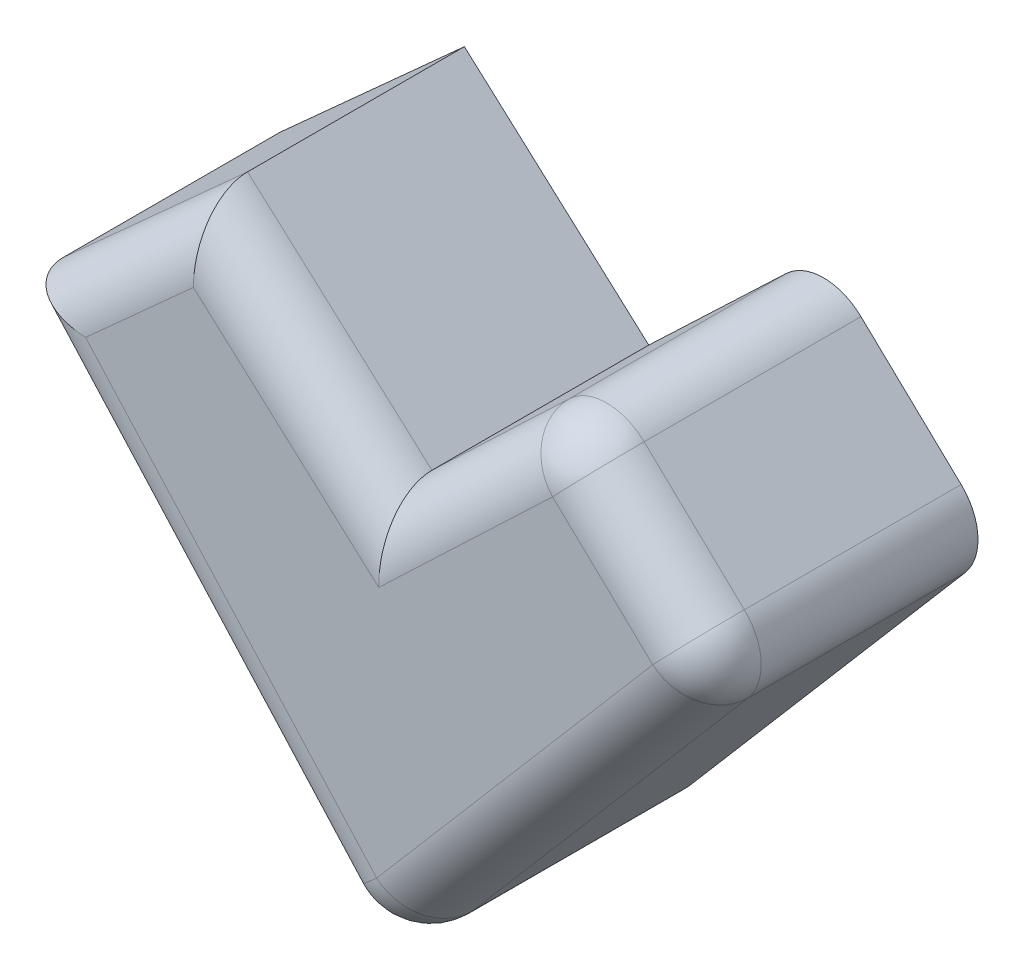
ISO-10303-21;
HEADER;
FILE_DESCRIPTION(('STEP AP214'),'2;1');
FILE_NAME('part.step','',(''),(''),'','','');
FILE_SCHEMA(('AUTOMOTIVE_DESIGN { 1 0 10303 214 1 1 1 1 }'));
ENDSEC;
DATA;
#1=APPLICATION_CONTEXT('core data for automotive mechanical design processes');
#2=APPLICATION_PROTOCOL_DEFINITION('international standard','automotive_design',2000,#1);
#3=PRODUCT_CONTEXT('',#1,'mechanical');
#4=PRODUCT('Part','Part','',(#3));
#5=PRODUCT_RELATED_PRODUCT_CATEGORY('part','',(#4));
#6=PRODUCT_DEFINITION_FORMATION('','',#4);
#7=PRODUCT_DEFINITION_CONTEXT('part definition',#1,'design');
#8=PRODUCT_DEFINITION('design','',#6,#7);
#9=PRODUCT_DEFINITION_SHAPE('','',#8);
#10=(LENGTH_UNIT() NAMED_UNIT(*) SI_UNIT(.MILLI.,.METRE.));
#11=(NAMED_UNIT(*) PLANE_ANGLE_UNIT() SI_UNIT($,.RADIAN.));
#12=(NAMED_UNIT(*) SI_UNIT($,.STERADIAN.) SOLID_ANGLE_UNIT());
#13=UNCERTAINTY_MEASURE_WITH_UNIT(LENGTH_MEASURE(1.E-05),#10,'distance_accuracy_value','');
#14=(GEOMETRIC_REPRESENTATION_CONTEXT(3) GLOBAL_UNCERTAINTY_ASSIGNED_CONTEXT((#13)) GLOBAL_UNIT_ASSIGNED_CONTEXT((#10,
#11,#12)) REPRESENTATION_CONTEXT('',''));
#15=CARTESIAN_POINT('',(0.,0.,0.));
#16=DIRECTION('',(0.,0.,1.));
#17=DIRECTION('',(1.,0.,0.));
#18=AXIS2_PLACEMENT_3D('',#15,#16,#17);
#19=CARTESIAN_POINT('',(64.5053511087993,75.4139,50.));
#20=DIRECTION('',(-0.759929047076846,0.650006033363442,0.));
#21=DIRECTION('',(-0.650006033363442,-0.759929047076846,0.));
#22=AXIS2_PLACEMENT_3D('',#19,#20,#21);
#23=PLANE('',#22);
#24=DIRECTION('',(0.650006033363442,0.759929047076846,0.));
#25=VECTOR('',#24,1.);
#26=CARTESIAN_POINT('',(0.,0.,40.));
#27=LINE('',#26,#25);
#28=CARTESIAN_POINT('',(58.3394809383722,68.2053148446183,40.));
#29=VERTEX_POINT('',#28);
#30=CARTESIAN_POINT('',(7.39998467828279,8.65140170446145,40.));
#31=VERTEX_POINT('',#30);
#32=EDGE_CURVE('E63',#29,#31,#27,.F.);
#33=ORIENTED_EDGE('',*,*,#32,.T.);
#34=DIRECTION('',(0.,0.,-1.));
#35=VECTOR('',#34,1.);
#36=CARTESIAN_POINT('',(7.39998467828279,8.65140170446145,50.));
#37=LINE('',#36,#35);
#38=CARTESIAN_POINT('',(7.39998467828281,8.65140170446147,0.));
#39=VERTEX_POINT('',#38);
#40=EDGE_CURVE('E229',#31,#39,#37,.T.);
#41=ORIENTED_EDGE('',*,*,#40,.T.);
#42=DIRECTION('',(0.650006033363442,0.759929047076846,0.));
#43=VECTOR('',#42,1.);
#44=CARTESIAN_POINT('',(64.5053511087993,75.4139,0.));
#45=LINE('',#44,#43);
#46=CARTESIAN_POINT('',(58.3394809383722,68.2053148446183,0.));
#47=VERTEX_POINT('',#46);
#48=EDGE_CURVE('E284',#39,#47,#45,.T.);
#49=ORIENTED_EDGE('',*,*,#48,.T.);
#50=DIRECTION('',(0.,0.,-1.));
#51=VECTOR('',#50,1.);
#52=CARTESIAN_POINT('',(58.3394809383722,68.2053148446183,50.));
#53=LINE('',#52,#51);
#54=EDGE_CURVE('E68',#47,#29,#53,.F.);
#55=ORIENTED_EDGE('',*,*,#54,.T.);
#56=EDGE_LOOP('',(#33,#41,#49,#55));
#57=FACE_BOUND('',#56,.T.);
#58=ADVANCED_FACE('F45',(#57),#23,.F.);
#59=CARTESIAN_POINT('',(32.2526755543997,106.09,50.));
#60=DIRECTION('',(-0.689175146522495,-0.724594795327498,0.));
#61=DIRECTION('',(0.724594795327498,-0.689175146522495,0.));
#62=AXIS2_PLACEMENT_3D('',#59,#60,#61);
#63=PLANE('',#62);
#64=DIRECTION('',(-0.724594795327498,0.689175146522495,0.));
#65=VECTOR('',#64,1.);
#66=CARTESIAN_POINT('',(64.5053511087993,75.4139,40.));
#67=LINE('',#66,#65);
#68=CARTESIAN_POINT('',(39.1444270196246,99.5351311871536,40.));
#69=VERTEX_POINT('',#68);
#70=CARTESIAN_POINT('',(57.6319419328287,81.9513231315277,40.));
#71=VERTEX_POINT('',#70);
#72=EDGE_CURVE('E219',#69,#71,#67,.F.);
#73=ORIENTED_EDGE('',*,*,#72,.T.);
#74=DIRECTION('',(0.,0.,-1.));
#75=VECTOR('',#74,1.);
#76=CARTESIAN_POINT('',(57.6319419328287,81.9513231315277,50.));
#77=LINE('',#76,#75);
#78=CARTESIAN_POINT('',(57.6319419328287,81.9513231315277,0.));
#79=VERTEX_POINT('',#78);
#80=EDGE_CURVE('E222',#71,#79,#77,.T.);
#81=ORIENTED_EDGE('',*,*,#80,.T.);
#82=DIRECTION('',(-0.724594795327498,0.689175146522495,0.));
#83=VECTOR('',#82,1.);
#84=CARTESIAN_POINT('',(32.2526755543997,106.09,0.));
#85=LINE('',#84,#83);
#86=CARTESIAN_POINT('',(39.1444270196246,99.5351311871536,0.));
#87=VERTEX_POINT('',#86);
#88=EDGE_CURVE('E148',#79,#87,#85,.T.);
#89=ORIENTED_EDGE('',*,*,#88,.T.);
#90=DIRECTION('',(0.,0.,-1.));
#91=VECTOR('',#90,1.);
#92=CARTESIAN_POINT('',(39.1444270196246,99.5351311871536,50.));
#93=LINE('',#92,#91);
#94=EDGE_CURVE('E216',#87,#69,#93,.F.);
#95=ORIENTED_EDGE('',*,*,#94,.T.);
#96=EDGE_LOOP('',(#73,#81,#89,#95));
#97=FACE_BOUND('',#96,.T.);
#98=ADVANCED_FACE('F294',(#97),#63,.F.);
#99=CARTESIAN_POINT('',(0.,75.4139,50.));
#100=DIRECTION('',(0.689175146522495,-0.724594795327498,0.));
#101=DIRECTION('',(0.724594795327498,0.689175146522495,0.));
#102=AXIS2_PLACEMENT_3D('',#99,#100,#101);
#103=PLANE('',#102);
#104=DIRECTION('',(0.,0.,-1.));
#105=VECTOR('',#104,1.);
#106=CARTESIAN_POINT('',(0.,75.4139,50.));
#107=LINE('',#106,#105);
#108=CARTESIAN_POINT('',(0.,75.4139,40.));
#109=VERTEX_POINT('',#108);
#110=CARTESIAN_POINT('',(0.,75.4139,0.));
#111=VERTEX_POINT('',#110);
#112=EDGE_CURVE('E139',#109,#111,#107,.T.);
#113=ORIENTED_EDGE('',*,*,#112,.F.);
#114=DIRECTION('',(-0.724594795327498,-0.689175146522495,0.));
#115=VECTOR('',#114,1.);
#116=CARTESIAN_POINT('',(32.2526755543997,106.09,40.));
#117=LINE('',#116,#115);
#118=CARTESIAN_POINT('',(25.3609240891747,99.5351311871536,40.));
#119=VERTEX_POINT('',#118);
#120=EDGE_CURVE('E213',#109,#119,#117,.F.);
#121=ORIENTED_EDGE('',*,*,#120,.T.);
#122=DIRECTION('',(0.,0.,-1.));
#123=VECTOR('',#122,1.);
#124=CARTESIAN_POINT('',(25.3609240891747,99.5351311871536,50.));
#125=LINE('',#124,#123);
#126=CARTESIAN_POINT('',(25.3609240891747,99.5351311871536,0.));
#127=VERTEX_POINT('',#126);
#128=EDGE_CURVE('E142',#119,#127,#125,.T.);
#129=ORIENTED_EDGE('',*,*,#128,.T.);
#130=DIRECTION('',(-0.724594795327498,-0.689175146522495,0.));
#131=VECTOR('',#130,1.);
#132=CARTESIAN_POINT('',(0.,75.4139,0.));
#133=LINE('',#132,#131);
#134=EDGE_CURVE('E136',#127,#111,#133,.T.);
#135=ORIENTED_EDGE('',*,*,#134,.T.);
#136=EDGE_LOOP('',(#113,#121,#129,#135));
#137=FACE_BOUND('',#136,.T.);
#138=ADVANCED_FACE('F138',(#137),#103,.F.);
#139=CARTESIAN_POINT('',(-34.0103244456003,106.09,50.));
#140=DIRECTION('',(-0.66977022809089,-0.742568408675643,0.));
#141=DIRECTION('',(0.742568408675643,-0.66977022809089,0.));
#142=AXIS2_PLACEMENT_3D('',#139,#140,#141);
#143=PLANE('',#142);
#144=DIRECTION('',(0.,0.,-1.));
#145=VECTOR('',#144,1.);
#146=CARTESIAN_POINT('',(-34.0103244456003,106.09,50.));
#147=LINE('',#146,#145);
#148=CARTESIAN_POINT('',(-34.0103244456003,106.09,40.));
#149=VERTEX_POINT('',#148);
#150=CARTESIAN_POINT('',(-34.0103244456003,106.09,0.));
#151=VERTEX_POINT('',#150);
#152=EDGE_CURVE('E159',#149,#151,#147,.T.);
#153=ORIENTED_EDGE('',*,*,#152,.F.);
#154=DIRECTION('',(-0.742568408675643,0.66977022809089,0.));
#155=VECTOR('',#154,1.);
#156=CARTESIAN_POINT('',(0.,75.4139,40.));
#157=LINE('',#156,#155);
#158=EDGE_CURVE('E156',#149,#109,#157,.F.);
#159=ORIENTED_EDGE('',*,*,#158,.T.);
#160=ORIENTED_EDGE('',*,*,#112,.T.);
#161=DIRECTION('',(-0.742568408675643,0.66977022809089,0.));
#162=VECTOR('',#161,1.);
#163=CARTESIAN_POINT('',(-34.0103244456003,106.09,0.));
#164=LINE('',#163,#162);
#165=EDGE_CURVE('E147',#111,#151,#164,.T.);
#166=ORIENTED_EDGE('',*,*,#165,.T.);
#167=EDGE_LOOP('',(#153,#159,#160,#166));
#168=FACE_BOUND('',#167,.T.);
#169=ADVANCED_FACE('F153',(#168),#143,.F.);
#170=CARTESIAN_POINT('',(-68.0206488912007,75.4139,50.));
#171=DIRECTION('',(0.66977022809089,-0.742568408675643,0.));
#172=DIRECTION('',(0.742568408675643,0.66977022809089,0.));
#173=AXIS2_PLACEMENT_3D('',#170,#171,#172);
#174=PLANE('',#173);
#175=DIRECTION('',(0.,0.,-1.));
#176=VECTOR('',#175,1.);
#177=CARTESIAN_POINT('',(-68.0206488912007,75.4139,50.));
#178=LINE('',#177,#176);
#179=CARTESIAN_POINT('',(-68.0206488912007,75.4139,40.));
#180=VERTEX_POINT('',#179);
#181=CARTESIAN_POINT('',(-68.0206488912007,75.4139,0.));
#182=VERTEX_POINT('',#181);
#183=EDGE_CURVE('E176',#180,#182,#178,.T.);
#184=ORIENTED_EDGE('',*,*,#183,.F.);
#185=DIRECTION('',(-0.742568408675643,-0.66977022809089,0.));
#186=VECTOR('',#185,1.);
#187=CARTESIAN_POINT('',(-34.0103244456003,106.09,40.));
#188=LINE('',#187,#186);
#189=EDGE_CURVE('E206',#180,#149,#188,.F.);
#190=ORIENTED_EDGE('',*,*,#189,.T.);
#191=ORIENTED_EDGE('',*,*,#152,.T.);
#192=DIRECTION('',(-0.742568408675643,-0.66977022809089,0.));
#193=VECTOR('',#192,1.);
#194=CARTESIAN_POINT('',(-68.0206488912007,75.4139,0.));
#195=LINE('',#194,#193);
#196=EDGE_CURVE('E165',#151,#182,#195,.T.);
#197=ORIENTED_EDGE('',*,*,#196,.T.);
#198=EDGE_LOOP('',(#184,#190,#191,#197));
#199=FACE_BOUND('',#198,.T.);
#200=ADVANCED_FACE('F316',(#199),#174,.F.);
#201=CARTESIAN_POINT('',(0.,0.,50.));
#202=DIRECTION('',(0.742568408675643,0.66977022809089,0.));
#203=DIRECTION('',(-0.66977022809089,0.742568408675643,0.));
#204=AXIS2_PLACEMENT_3D('',#201,#202,#203);
#205=PLANE('',#204);
#206=DIRECTION('',(0.,0.,-1.));
#207=VECTOR('',#206,1.);
#208=CARTESIAN_POINT('',(-7.62498987924212,8.45375975718697,50.));
#209=LINE('',#208,#207);
#210=CARTESIAN_POINT('',(-7.62498987924212,8.45375975718697,0.));
#211=VERTEX_POINT('',#210);
#212=CARTESIAN_POINT('',(-7.62498987924212,8.45375975718697,40.));
#213=VERTEX_POINT('',#212);
#214=EDGE_CURVE('E199',#211,#213,#209,.F.);
#215=ORIENTED_EDGE('',*,*,#214,.T.);
#216=DIRECTION('',(0.66977022809089,-0.742568408675643,0.));
#217=VECTOR('',#216,1.);
#218=CARTESIAN_POINT('',(-68.0206488912007,75.4139,40.));
#219=LINE('',#218,#217);
#220=EDGE_CURVE('E202',#213,#180,#219,.F.);
#221=ORIENTED_EDGE('',*,*,#220,.T.);
#222=ORIENTED_EDGE('',*,*,#183,.T.);
#223=DIRECTION('',(0.66977022809089,-0.742568408675643,0.));
#224=VECTOR('',#223,1.);
#225=CARTESIAN_POINT('',(0.,0.,0.));
#226=LINE('',#225,#224);
#227=EDGE_CURVE('E169',#182,#211,#226,.T.);
#228=ORIENTED_EDGE('',*,*,#227,.T.);
#229=EDGE_LOOP('',(#215,#221,#222,#228));
#230=FACE_BOUND('',#229,.T.);
#231=ADVANCED_FACE('F313',(#230),#205,.F.);
#232=CARTESIAN_POINT('',(0.,0.,50.));
#233=DIRECTION('',(0.,0.,1.));
#234=DIRECTION('',(1.,0.,0.));
#235=AXIS2_PLACEMENT_3D('',#232,#233,#234);
#236=PLANE('',#235);
#237=DIRECTION('',(-0.742568408675643,-0.66977022809089,0.));
#238=VECTOR('',#237,1.);
#239=CARTESIAN_POINT('',(-61.3229466102918,67.9882159132436,50.));
#240=LINE('',#239,#238);
#241=CARTESIAN_POINT('',(-34.0103244456003,92.623227264765,50.));
#242=VERTEX_POINT('',#241);
#243=CARTESIAN_POINT('',(-53.8972625235354,74.6859181941525,50.));
#244=VERTEX_POINT('',#243);
#245=EDGE_CURVE('E192',#242,#244,#240,.T.);
#246=ORIENTED_EDGE('',*,*,#245,.T.);
#247=DIRECTION('',(0.66977022809089,-0.742568408675643,0.));
#248=VECTOR('',#247,1.);
#249=CARTESIAN_POINT('',(7.42568408675643,6.6977022809089,50.));
#250=LINE('',#249,#248);
#251=CARTESIAN_POINT('',(-0.199305792485674,15.1514620380959,50.));
#252=VERTEX_POINT('',#251);
#253=EDGE_CURVE('E195',#244,#252,#250,.T.);
#254=ORIENTED_EDGE('',*,*,#253,.T.);
#255=DIRECTION('',(0.650006033363442,0.759929047076846,0.));
#256=VECTOR('',#255,1.);
#257=CARTESIAN_POINT('',(56.9060606380309,81.9139603336344,50.));
#258=LINE('',#257,#256);
#259=CARTESIAN_POINT('',(50.7401904676038,74.7053751782528,50.));
#260=VERTEX_POINT('',#259);
#261=EDGE_CURVE('E158',#252,#260,#258,.T.);
#262=ORIENTED_EDGE('',*,*,#261,.T.);
#263=DIRECTION('',(-0.724594795327498,0.689175146522495,0.));
#264=VECTOR('',#263,1.);
#265=CARTESIAN_POINT('',(25.3609240891747,98.844052046725,50.));
#266=LINE('',#265,#264);
#267=CARTESIAN_POINT('',(32.2526755543997,92.2891832338786,50.));
#268=VERTEX_POINT('',#267);
#269=EDGE_CURVE('E183',#260,#268,#266,.T.);
#270=ORIENTED_EDGE('',*,*,#269,.T.);
#271=DIRECTION('',(-0.724594795327498,-0.689175146522495,0.));
#272=VECTOR('',#271,1.);
#273=CARTESIAN_POINT('',(6.89175146522495,68.167952046725,50.));
#274=LINE('',#273,#272);
#275=CARTESIAN_POINT('',(0.180263998169268,61.7845355657918,50.));
#276=VERTEX_POINT('',#275);
#277=EDGE_CURVE('E186',#268,#276,#274,.T.);
#278=ORIENTED_EDGE('',*,*,#277,.T.);
#279=DIRECTION('',(-0.742568408675643,0.66977022809089,0.));
#280=VECTOR('',#279,1.);
#281=CARTESIAN_POINT('',(-40.7080267265092,98.6643159132436,50.));
#282=LINE('',#281,#280);
#283=EDGE_CURVE('E189',#276,#242,#282,.T.);
#284=ORIENTED_EDGE('',*,*,#283,.T.);
#285=EDGE_LOOP('',(#246,#254,#262,#270,#278,#284));
#286=FACE_BOUND('',#285,.T.);
#287=ADVANCED_FACE('F329',(#286),#236,.T.);
#288=CARTESIAN_POINT('',(0.,0.,0.));
#289=DIRECTION('',(0.,0.,1.));
#290=DIRECTION('',(1.,0.,0.));
#291=AXIS2_PLACEMENT_3D('',#288,#289,#290);
#292=PLANE('',#291);
#293=ORIENTED_EDGE('',*,*,#48,.F.);
#294=CARTESIAN_POINT('',(-0.199305792485678,15.1514620380959,0.));
#295=DIRECTION('',(0.,0.,1.));
#296=DIRECTION('',(1.,0.,0.));
#297=AXIS2_PLACEMENT_3D('',#294,#295,#296);
#298=CIRCLE('',#297,10.);
#299=EDGE_CURVE('E11',#39,#211,#298,.F.);
#300=ORIENTED_EDGE('',*,*,#299,.T.);
#301=ORIENTED_EDGE('',*,*,#227,.F.);
#302=ORIENTED_EDGE('',*,*,#196,.F.);
#303=ORIENTED_EDGE('',*,*,#165,.F.);
#304=ORIENTED_EDGE('',*,*,#134,.F.);
#305=CARTESIAN_POINT('',(32.2526755543996,92.2891832338786,0.));
#306=DIRECTION('',(0.,0.,1.));
#307=DIRECTION('',(1.,0.,0.));
#308=AXIS2_PLACEMENT_3D('',#305,#306,#307);
#309=CIRCLE('',#308,10.);
#310=EDGE_CURVE('E232',#127,#87,#309,.F.);
#311=ORIENTED_EDGE('',*,*,#310,.T.);
#312=ORIENTED_EDGE('',*,*,#88,.F.);
#313=CARTESIAN_POINT('',(50.7401904676038,74.7053751782528,0.));
#314=DIRECTION('',(0.,0.,1.));
#315=DIRECTION('',(1.,0.,0.));
#316=AXIS2_PLACEMENT_3D('',#313,#314,#315);
#317=CIRCLE('',#316,10.);
#318=EDGE_CURVE('E55',#79,#47,#317,.F.);
#319=ORIENTED_EDGE('',*,*,#318,.T.);
#320=EDGE_LOOP('',(#293,#300,#301,#302,#303,#304,#311,#312,#319));
#321=FACE_BOUND('',#320,.T.);
#322=ADVANCED_FACE('F162',(#321),#292,.F.);
#323=CARTESIAN_POINT('',(32.2526755543996,92.2891832338786,50.));
#324=DIRECTION('',(0.,0.,-1.));
#325=DIRECTION('',(-1.,0.,0.));
#326=AXIS2_PLACEMENT_3D('',#323,#324,#325);
#327=CYLINDRICAL_SURFACE('',#326,10.);
#328=CARTESIAN_POINT('',(32.2526755543997,92.2891832338786,40.));
#329=DIRECTION('',(0.,0.,1.));
#330=DIRECTION('',(1.,0.,0.));
#331=AXIS2_PLACEMENT_3D('',#328,#329,#330);
#332=CIRCLE('',#331,10.);
#333=EDGE_CURVE('E49',#69,#119,#332,.T.);
#334=ORIENTED_EDGE('',*,*,#333,.F.);
#335=ORIENTED_EDGE('',*,*,#94,.F.);
#336=ORIENTED_EDGE('',*,*,#310,.F.);
#337=ORIENTED_EDGE('',*,*,#128,.F.);
#338=EDGE_LOOP('',(#334,#335,#336,#337));
#339=FACE_BOUND('',#338,.T.);
#340=ADVANCED_FACE('F47',(#339),#327,.T.);
#341=CARTESIAN_POINT('',(32.2526755543997,92.2891832338786,40.));
#342=DIRECTION('',(0.,0.,1.));
#343=DIRECTION('',(1.,0.,0.));
#344=AXIS2_PLACEMENT_3D('',#341,#342,#343);
#345=SPHERICAL_SURFACE('',#344,10.);
#346=CARTESIAN_POINT('',(32.2526755543996,92.2891832338786,40.));
#347=DIRECTION('',(0.724594795327498,0.689175146522495,0.));
#348=DIRECTION('',(-0.689175146522495,0.724594795327498,0.));
#349=AXIS2_PLACEMENT_3D('',#346,#347,#348);
#350=CIRCLE('',#349,10.);
#351=EDGE_CURVE('E271',#268,#119,#350,.F.);
#352=ORIENTED_EDGE('',*,*,#351,.F.);
#353=CARTESIAN_POINT('',(32.2526755543997,92.2891832338786,40.));
#354=DIRECTION('',(-0.724594795327498,0.689175146522494,0.));
#355=DIRECTION('',(-0.689175146522494,-0.724594795327498,0.));
#356=AXIS2_PLACEMENT_3D('',#353,#354,#355);
#357=CIRCLE('',#356,10.);
#358=EDGE_CURVE('E274',#69,#268,#357,.F.);
#359=ORIENTED_EDGE('',*,*,#358,.F.);
#360=ORIENTED_EDGE('',*,*,#333,.T.);
#361=EDGE_LOOP('',(#352,#359,#360));
#362=FACE_BOUND('',#361,.T.);
#363=ADVANCED_FACE('F298',(#362),#345,.T.);
#364=CARTESIAN_POINT('',(61.4055084753548,64.5613993339622,40.));
#365=DIRECTION('',(0.724594795327498,-0.689175146522495,0.));
#366=DIRECTION('',(0.689175146522495,0.724594795327498,0.));
#367=AXIS2_PLACEMENT_3D('',#364,#365,#366);
#368=CYLINDRICAL_SURFACE('',#367,10.);
#369=ORIENTED_EDGE('',*,*,#358,.T.);
#370=ORIENTED_EDGE('',*,*,#269,.F.);
#371=CARTESIAN_POINT('',(50.7401904676038,74.7053751782528,40.));
#372=DIRECTION('',(0.724594795327498,-0.689175146522495,0.));
#373=DIRECTION('',(0.689175146522495,0.724594795327498,0.));
#374=AXIS2_PLACEMENT_3D('',#371,#372,#373);
#375=CIRCLE('',#374,10.);
#376=EDGE_CURVE('E267',#71,#260,#375,.T.);
#377=ORIENTED_EDGE('',*,*,#376,.F.);
#378=ORIENTED_EDGE('',*,*,#72,.F.);
#379=EDGE_LOOP('',(#369,#370,#377,#378));
#380=FACE_BOUND('',#379,.T.);
#381=ADVANCED_FACE('F301',(#380),#368,.T.);
#382=CARTESIAN_POINT('',(50.7401904676038,74.7053751782528,50.));
#383=DIRECTION('',(0.,0.,-1.));
#384=DIRECTION('',(-1.,0.,0.));
#385=AXIS2_PLACEMENT_3D('',#382,#383,#384);
#386=CYLINDRICAL_SURFACE('',#385,10.);
#387=ORIENTED_EDGE('',*,*,#318,.F.);
#388=ORIENTED_EDGE('',*,*,#80,.F.);
#389=CARTESIAN_POINT('',(50.7401904676038,74.7053751782528,40.));
#390=DIRECTION('',(0.,0.,1.));
#391=DIRECTION('',(1.,0.,0.));
#392=AXIS2_PLACEMENT_3D('',#389,#390,#391);
#393=CIRCLE('',#392,10.);
#394=EDGE_CURVE('E263',#29,#71,#393,.T.);
#395=ORIENTED_EDGE('',*,*,#394,.F.);
#396=ORIENTED_EDGE('',*,*,#54,.F.);
#397=EDGE_LOOP('',(#387,#388,#395,#396));
#398=FACE_BOUND('',#397,.T.);
#399=ADVANCED_FACE('F303',(#398),#386,.T.);
#400=CARTESIAN_POINT('',(-30.7678932232826,32.3491864227507,40.));
#401=DIRECTION('',(0.724594795327498,0.689175146522495,0.));
#402=DIRECTION('',(-0.689175146522495,0.724594795327498,0.));
#403=AXIS2_PLACEMENT_3D('',#400,#401,#402);
#404=CYLINDRICAL_SURFACE('',#403,10.);
#405=ORIENTED_EDGE('',*,*,#351,.T.);
#406=ORIENTED_EDGE('',*,*,#120,.F.);
#407=CARTESIAN_POINT('',(0.180263998169259,61.7845355657918,40.));
#408=DIRECTION('',(0.999912545971381,0.0132249918348355,0.));
#409=DIRECTION('',(0.0132249918348356,-0.999912545971381,0.));
#410=AXIS2_PLACEMENT_3D('',#407,#408,#409);
#411=ELLIPSE('',#410,13.6305564812848,10.);
#412=EDGE_CURVE('E259',#276,#109,#411,.F.);
#413=ORIENTED_EDGE('',*,*,#412,.F.);
#414=ORIENTED_EDGE('',*,*,#277,.F.);
#415=EDGE_LOOP('',(#405,#406,#413,#414));
#416=FACE_BOUND('',#415,.T.);
#417=ADVANCED_FACE('F331',(#416),#404,.T.);
#418=CARTESIAN_POINT('',(50.7401904676038,74.7053751782528,40.));
#419=DIRECTION('',(0.,0.,1.));
#420=DIRECTION('',(1.,0.,0.));
#421=AXIS2_PLACEMENT_3D('',#418,#419,#420);
#422=SPHERICAL_SURFACE('',#421,10.);
#423=ORIENTED_EDGE('',*,*,#394,.T.);
#424=ORIENTED_EDGE('',*,*,#376,.T.);
#425=CARTESIAN_POINT('',(50.7401904676038,74.7053751782528,40.));
#426=DIRECTION('',(0.650006033363443,0.759929047076846,0.));
#427=DIRECTION('',(-0.759929047076846,0.650006033363443,0.));
#428=AXIS2_PLACEMENT_3D('',#425,#426,#427);
#429=CIRCLE('',#428,10.);
#430=EDGE_CURVE('E255',#29,#260,#429,.F.);
#431=ORIENTED_EDGE('',*,*,#430,.F.);
#432=EDGE_LOOP('',(#423,#424,#431));
#433=FACE_BOUND('',#432,.T.);
#434=ADVANCED_FACE('F333',(#433),#422,.T.);
#435=CARTESIAN_POINT('',(30.809416905908,34.1581317360973,40.));
#436=DIRECTION('',(0.742568408675643,-0.66977022809089,0.));
#437=DIRECTION('',(0.66977022809089,0.742568408675643,0.));
#438=AXIS2_PLACEMENT_3D('',#435,#436,#437);
#439=CYLINDRICAL_SURFACE('',#438,10.);
#440=ORIENTED_EDGE('',*,*,#412,.T.);
#441=ORIENTED_EDGE('',*,*,#158,.F.);
#442=CARTESIAN_POINT('',(-34.0103244456003,92.623227264765,40.));
#443=DIRECTION('',(1.,0.,0.));
#444=DIRECTION('',(0.,-1.,0.));
#445=AXIS2_PLACEMENT_3D('',#442,#443,#444);
#446=ELLIPSE('',#445,13.466772735235,10.);
#447=EDGE_CURVE('E251',#242,#149,#446,.F.);
#448=ORIENTED_EDGE('',*,*,#447,.F.);
#449=ORIENTED_EDGE('',*,*,#283,.F.);
#450=EDGE_LOOP('',(#440,#441,#448,#449));
#451=FACE_BOUND('',#450,.T.);
#452=ADVANCED_FACE('F320',(#451),#439,.T.);
#453=CARTESIAN_POINT('',(-7.59929047076847,6.50006033363443,40.));
#454=DIRECTION('',(-0.650006033363442,-0.759929047076846,0.));
#455=DIRECTION('',(0.759929047076846,-0.650006033363442,0.));
#456=AXIS2_PLACEMENT_3D('',#453,#454,#455);
#457=CYLINDRICAL_SURFACE('',#456,10.);
#458=ORIENTED_EDGE('',*,*,#430,.T.);
#459=ORIENTED_EDGE('',*,*,#261,.F.);
#460=CARTESIAN_POINT('',(-0.19930579248567,15.1514620380959,40.));
#461=DIRECTION('',(-0.650006033363442,-0.759929047076846,0.));
#462=DIRECTION('',(0.759929047076847,-0.650006033363442,0.));
#463=AXIS2_PLACEMENT_3D('',#460,#461,#462);
#464=CIRCLE('',#463,10.);
#465=EDGE_CURVE('E247',#31,#252,#464,.T.);
#466=ORIENTED_EDGE('',*,*,#465,.F.);
#467=ORIENTED_EDGE('',*,*,#32,.F.);
#468=EDGE_LOOP('',(#458,#459,#466,#467));
#469=FACE_BOUND('',#468,.T.);
#470=ADVANCED_FACE('F362',(#469),#457,.T.);
#471=CARTESIAN_POINT('',(-0.199305792485678,15.1514620380959,50.));
#472=DIRECTION('',(0.,0.,-1.));
#473=DIRECTION('',(-1.,0.,0.));
#474=AXIS2_PLACEMENT_3D('',#471,#472,#473);
#475=CYLINDRICAL_SURFACE('',#474,10.);
#476=ORIENTED_EDGE('',*,*,#299,.F.);
#477=ORIENTED_EDGE('',*,*,#40,.F.);
#478=CARTESIAN_POINT('',(-0.199305792485683,15.1514620380959,40.));
#479=DIRECTION('',(0.,0.,1.));
#480=DIRECTION('',(1.,0.,0.));
#481=AXIS2_PLACEMENT_3D('',#478,#479,#480);
#482=CIRCLE('',#481,10.);
#483=EDGE_CURVE('E243',#213,#31,#482,.T.);
#484=ORIENTED_EDGE('',*,*,#483,.F.);
#485=ORIENTED_EDGE('',*,*,#214,.F.);
#486=EDGE_LOOP('',(#476,#477,#484,#485));
#487=FACE_BOUND('',#486,.T.);
#488=ADVANCED_FACE('F308',(#487),#475,.T.);
#489=CARTESIAN_POINT('',(-61.3229466102918,67.9882159132436,40.));
#490=DIRECTION('',(0.742568408675643,0.66977022809089,0.));
#491=DIRECTION('',(-0.66977022809089,0.742568408675643,0.));
#492=AXIS2_PLACEMENT_3D('',#489,#490,#491);
#493=CYLINDRICAL_SURFACE('',#492,10.);
#494=ORIENTED_EDGE('',*,*,#447,.T.);
#495=ORIENTED_EDGE('',*,*,#189,.F.);
#496=CARTESIAN_POINT('',(-53.8972625235354,74.6859181941525,40.));
#497=DIRECTION('',(0.0514760871495219,0.99867422738938,0.));
#498=DIRECTION('',(0.99867422738938,-0.051476087149522,0.));
#499=AXIS2_PLACEMENT_3D('',#496,#497,#498);
#500=ELLIPSE('',#499,14.1421356237309,10.);
#501=EDGE_CURVE('E240',#244,#180,#500,.F.);
#502=ORIENTED_EDGE('',*,*,#501,.F.);
#503=ORIENTED_EDGE('',*,*,#245,.F.);
#504=EDGE_LOOP('',(#494,#495,#502,#503));
#505=FACE_BOUND('',#504,.T.);
#506=ADVANCED_FACE('F325',(#505),#493,.T.);
#507=CARTESIAN_POINT('',(-0.199305792485683,15.1514620380959,40.));
#508=DIRECTION('',(0.,0.,1.));
#509=DIRECTION('',(1.,0.,0.));
#510=AXIS2_PLACEMENT_3D('',#507,#508,#509);
#511=SPHERICAL_SURFACE('',#510,10.);
#512=ORIENTED_EDGE('',*,*,#483,.T.);
#513=ORIENTED_EDGE('',*,*,#465,.T.);
#514=CARTESIAN_POINT('',(-0.199305792485674,15.1514620380959,40.));
#515=DIRECTION('',(0.669770228090889,-0.742568408675644,0.));
#516=DIRECTION('',(0.742568408675644,0.669770228090889,0.));
#517=AXIS2_PLACEMENT_3D('',#514,#515,#516);
#518=CIRCLE('',#517,10.);
#519=EDGE_CURVE('E237',#213,#252,#518,.F.);
#520=ORIENTED_EDGE('',*,*,#519,.F.);
#521=EDGE_LOOP('',(#512,#513,#520));
#522=FACE_BOUND('',#521,.T.);
#523=ADVANCED_FACE('F353',(#522),#511,.T.);
#524=CARTESIAN_POINT('',(7.42568408675643,6.6977022809089,40.));
#525=DIRECTION('',(-0.66977022809089,0.742568408675643,0.));
#526=DIRECTION('',(-0.742568408675643,-0.66977022809089,0.));
#527=AXIS2_PLACEMENT_3D('',#524,#525,#526);
#528=CYLINDRICAL_SURFACE('',#527,10.);
#529=ORIENTED_EDGE('',*,*,#501,.T.);
#530=ORIENTED_EDGE('',*,*,#220,.F.);
#531=ORIENTED_EDGE('',*,*,#519,.T.);
#532=ORIENTED_EDGE('',*,*,#253,.F.);
#533=EDGE_LOOP('',(#529,#530,#531,#532));
#534=FACE_BOUND('',#533,.T.);
#535=ADVANCED_FACE('F350',(#534),#528,.T.);
#536=CLOSED_SHELL('',(#58,#98,#138,#169,#200,#231,#287,#322,#340,#363,#381,#399,#417,#434,#452,
#470,#488,#506,#523,#535));
#537=MANIFOLD_SOLID_BREP('B2',#536);
#538=ADVANCED_BREP_SHAPE_REPRESENTATION('',(#18,#537),#14);
#539=SHAPE_DEFINITION_REPRESENTATION(#9,#538);
ENDSEC;
END-ISO-10303-21;
